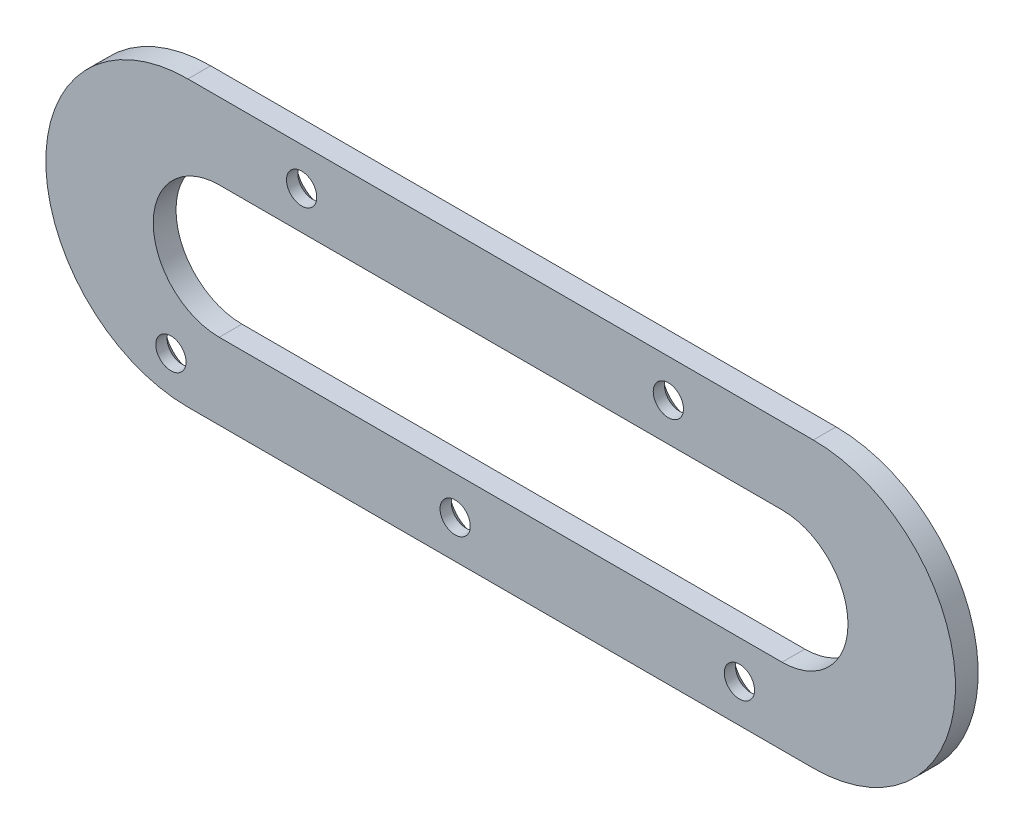
ISO-10303-21;
HEADER;
FILE_DESCRIPTION(('STEP AP214'),'2;1');
FILE_NAME('part.step','',(''),(''),'','','');
FILE_SCHEMA(('AUTOMOTIVE_DESIGN { 1 0 10303 214 1 1 1 1 }'));
ENDSEC;
DATA;
#1=APPLICATION_CONTEXT('core data for automotive mechanical design processes');
#2=APPLICATION_PROTOCOL_DEFINITION('international standard','automotive_design',2000,#1);
#3=PRODUCT_CONTEXT('',#1,'mechanical');
#4=PRODUCT('Part','Part','',(#3));
#5=PRODUCT_RELATED_PRODUCT_CATEGORY('part','',(#4));
#6=PRODUCT_DEFINITION_FORMATION('','',#4);
#7=PRODUCT_DEFINITION_CONTEXT('part definition',#1,'design');
#8=PRODUCT_DEFINITION('design','',#6,#7);
#9=PRODUCT_DEFINITION_SHAPE('','',#8);
#10=(LENGTH_UNIT() NAMED_UNIT(*) SI_UNIT(.MILLI.,.METRE.));
#11=(NAMED_UNIT(*) PLANE_ANGLE_UNIT() SI_UNIT($,.RADIAN.));
#12=(NAMED_UNIT(*) SI_UNIT($,.STERADIAN.) SOLID_ANGLE_UNIT());
#13=UNCERTAINTY_MEASURE_WITH_UNIT(LENGTH_MEASURE(1.E-05),#10,'distance_accuracy_value','');
#14=(GEOMETRIC_REPRESENTATION_CONTEXT(3) GLOBAL_UNCERTAINTY_ASSIGNED_CONTEXT((#13)) GLOBAL_UNIT_ASSIGNED_CONTEXT((#10,
#11,#12)) REPRESENTATION_CONTEXT('',''));
#15=CARTESIAN_POINT('',(0.,0.,0.));
#16=DIRECTION('',(0.,0.,1.));
#17=DIRECTION('',(1.,0.,0.));
#18=AXIS2_PLACEMENT_3D('',#15,#16,#17);
#19=CARTESIAN_POINT('',(-95.25,-16.8817402630384,5.08));
#20=DIRECTION('',(0.,0.,-1.));
#21=DIRECTION('',(-1.,0.,0.));
#22=AXIS2_PLACEMENT_3D('',#19,#20,#21);
#23=CYLINDRICAL_SURFACE('',#22,31.75);
#24=CARTESIAN_POINT('',(-95.25,-16.8817402630384,0.));
#25=DIRECTION('',(0.,0.,1.));
#26=DIRECTION('',(1.,0.,0.));
#27=AXIS2_PLACEMENT_3D('',#24,#25,#26);
#28=CIRCLE('',#27,31.75);
#29=CARTESIAN_POINT('',(-95.25,-48.6317402630384,0.));
#30=VERTEX_POINT('',#29);
#31=CARTESIAN_POINT('',(-95.25,14.8682597369616,0.));
#32=VERTEX_POINT('',#31);
#33=EDGE_CURVE('E136',#30,#32,#28,.T.);
#34=ORIENTED_EDGE('',*,*,#33,.T.);
#35=DIRECTION('',(0.,0.,-1.));
#36=VECTOR('',#35,1.);
#37=CARTESIAN_POINT('',(-95.25,14.8682597369616,5.08));
#38=LINE('',#37,#36);
#39=CARTESIAN_POINT('',(-95.25,14.8682597369616,5.08));
#40=VERTEX_POINT('',#39);
#41=EDGE_CURVE('E11',#40,#32,#38,.T.);
#42=ORIENTED_EDGE('',*,*,#41,.F.);
#43=CARTESIAN_POINT('',(-95.25,-16.8817402630384,5.08));
#44=DIRECTION('',(0.,0.,1.));
#45=DIRECTION('',(1.,0.,0.));
#46=AXIS2_PLACEMENT_3D('',#43,#44,#45);
#47=CIRCLE('',#46,31.75);
#48=CARTESIAN_POINT('',(-95.25,-48.6317402630384,5.08));
#49=VERTEX_POINT('',#48);
#50=EDGE_CURVE('E137',#49,#40,#47,.T.);
#51=ORIENTED_EDGE('',*,*,#50,.F.);
#52=DIRECTION('',(0.,0.,-1.));
#53=VECTOR('',#52,1.);
#54=CARTESIAN_POINT('',(-95.25,-48.6317402630384,5.08));
#55=LINE('',#54,#53);
#56=EDGE_CURVE('E147',#49,#30,#55,.T.);
#57=ORIENTED_EDGE('',*,*,#56,.T.);
#58=EDGE_LOOP('',(#34,#42,#51,#57));
#59=FACE_BOUND('',#58,.T.);
#60=ADVANCED_FACE('F37',(#59),#23,.T.);
#61=CARTESIAN_POINT('',(-95.25,14.8682597369616,5.08));
#62=DIRECTION('',(0.,-1.,0.));
#63=DIRECTION('',(1.,0.,0.));
#64=AXIS2_PLACEMENT_3D('',#61,#62,#63);
#65=PLANE('',#64);
#66=DIRECTION('',(-1.,0.,0.));
#67=VECTOR('',#66,1.);
#68=CARTESIAN_POINT('',(-95.25,14.8682597369616,0.));
#69=LINE('',#68,#67);
#70=CARTESIAN_POINT('',(-234.95,14.8682597369616,0.));
#71=VERTEX_POINT('',#70);
#72=EDGE_CURVE('E150',#32,#71,#69,.T.);
#73=ORIENTED_EDGE('',*,*,#72,.T.);
#74=DIRECTION('',(0.,0.,-1.));
#75=VECTOR('',#74,1.);
#76=CARTESIAN_POINT('',(-234.95,14.8682597369616,5.08));
#77=LINE('',#76,#75);
#78=CARTESIAN_POINT('',(-234.95,14.8682597369616,5.08));
#79=VERTEX_POINT('',#78);
#80=EDGE_CURVE('E44',#79,#71,#77,.T.);
#81=ORIENTED_EDGE('',*,*,#80,.F.);
#82=DIRECTION('',(-1.,0.,0.));
#83=VECTOR('',#82,1.);
#84=CARTESIAN_POINT('',(-95.25,14.8682597369616,5.08));
#85=LINE('',#84,#83);
#86=EDGE_CURVE('E140',#40,#79,#85,.T.);
#87=ORIENTED_EDGE('',*,*,#86,.F.);
#88=ORIENTED_EDGE('',*,*,#41,.T.);
#89=EDGE_LOOP('',(#73,#81,#87,#88));
#90=FACE_BOUND('',#89,.T.);
#91=ADVANCED_FACE('F178',(#90),#65,.F.);
#92=CARTESIAN_POINT('',(-234.95,-16.8817402630384,5.08));
#93=DIRECTION('',(0.,0.,-1.));
#94=DIRECTION('',(-1.,0.,0.));
#95=AXIS2_PLACEMENT_3D('',#92,#93,#94);
#96=CYLINDRICAL_SURFACE('',#95,31.75);
#97=CARTESIAN_POINT('',(-234.95,-16.8817402630384,0.));
#98=DIRECTION('',(0.,0.,1.));
#99=DIRECTION('',(1.,0.,0.));
#100=AXIS2_PLACEMENT_3D('',#97,#98,#99);
#101=CIRCLE('',#100,31.75);
#102=CARTESIAN_POINT('',(-234.95,-48.6317402630384,0.));
#103=VERTEX_POINT('',#102);
#104=EDGE_CURVE('E152',#71,#103,#101,.T.);
#105=ORIENTED_EDGE('',*,*,#104,.T.);
#106=DIRECTION('',(0.,0.,-1.));
#107=VECTOR('',#106,1.);
#108=CARTESIAN_POINT('',(-234.95,-48.6317402630384,5.08));
#109=LINE('',#108,#107);
#110=CARTESIAN_POINT('',(-234.95,-48.6317402630384,5.08));
#111=VERTEX_POINT('',#110);
#112=EDGE_CURVE('E157',#111,#103,#109,.T.);
#113=ORIENTED_EDGE('',*,*,#112,.F.);
#114=CARTESIAN_POINT('',(-234.95,-16.8817402630384,5.08));
#115=DIRECTION('',(0.,0.,1.));
#116=DIRECTION('',(1.,0.,0.));
#117=AXIS2_PLACEMENT_3D('',#114,#115,#116);
#118=CIRCLE('',#117,31.75);
#119=EDGE_CURVE('E143',#79,#111,#118,.T.);
#120=ORIENTED_EDGE('',*,*,#119,.F.);
#121=ORIENTED_EDGE('',*,*,#80,.T.);
#122=EDGE_LOOP('',(#105,#113,#120,#121));
#123=FACE_BOUND('',#122,.T.);
#124=ADVANCED_FACE('F164',(#123),#96,.T.);
#125=CARTESIAN_POINT('',(-95.25,-48.6317402630384,5.08));
#126=DIRECTION('',(0.,1.,0.));
#127=DIRECTION('',(-1.,0.,0.));
#128=AXIS2_PLACEMENT_3D('',#125,#126,#127);
#129=PLANE('',#128);
#130=DIRECTION('',(1.,0.,0.));
#131=VECTOR('',#130,1.);
#132=CARTESIAN_POINT('',(-95.25,-48.6317402630384,0.));
#133=LINE('',#132,#131);
#134=EDGE_CURVE('E141',#103,#30,#133,.T.);
#135=ORIENTED_EDGE('',*,*,#134,.T.);
#136=ORIENTED_EDGE('',*,*,#56,.F.);
#137=DIRECTION('',(1.,0.,0.));
#138=VECTOR('',#137,1.);
#139=CARTESIAN_POINT('',(-95.25,-48.6317402630384,5.08));
#140=LINE('',#139,#138);
#141=EDGE_CURVE('E145',#111,#49,#140,.T.);
#142=ORIENTED_EDGE('',*,*,#141,.F.);
#143=ORIENTED_EDGE('',*,*,#112,.T.);
#144=EDGE_LOOP('',(#135,#136,#142,#143));
#145=FACE_BOUND('',#144,.T.);
#146=ADVANCED_FACE('F171',(#145),#129,.F.);
#147=CARTESIAN_POINT('',(-95.25,-16.8817402630384,5.08));
#148=DIRECTION('',(0.,0.,1.));
#149=DIRECTION('',(1.,0.,0.));
#150=AXIS2_PLACEMENT_3D('',#147,#148,#149);
#151=PLANE('',#150);
#152=CARTESIAN_POINT('',(-238.76,-40.1227402630385,5.08000000000001));
#153=DIRECTION('',(0.,0.,-1.));
#154=DIRECTION('',(-1.,0.,0.));
#155=AXIS2_PLACEMENT_3D('',#152,#153,#154);
#156=CIRCLE('',#155,3.3782);
#157=CARTESIAN_POINT('',(-242.1382,-40.1227402630385,5.08000000000001));
#158=VERTEX_POINT('',#157);
#159=EDGE_CURVE('E254',#158,#158,#156,.T.);
#160=ORIENTED_EDGE('',*,*,#159,.T.);
#161=EDGE_LOOP('',(#160));
#162=FACE_BOUND('',#161,.T.);
#163=CARTESIAN_POINT('',(-111.76,-40.1227402630385,5.08000000000001));
#164=DIRECTION('',(0.,0.,-1.));
#165=DIRECTION('',(-1.,0.,0.));
#166=AXIS2_PLACEMENT_3D('',#163,#164,#165);
#167=CIRCLE('',#166,3.3782);
#168=CARTESIAN_POINT('',(-115.1382,-40.1227402630385,5.08000000000001));
#169=VERTEX_POINT('',#168);
#170=EDGE_CURVE('E265',#169,#169,#167,.T.);
#171=ORIENTED_EDGE('',*,*,#170,.T.);
#172=EDGE_LOOP('',(#171));
#173=FACE_BOUND('',#172,.T.);
#174=CARTESIAN_POINT('',(-175.26,-40.1227402630385,5.08000000000001));
#175=DIRECTION('',(0.,0.,-1.));
#176=DIRECTION('',(-1.,0.,0.));
#177=AXIS2_PLACEMENT_3D('',#174,#175,#176);
#178=CIRCLE('',#177,3.3782);
#179=CARTESIAN_POINT('',(-178.6382,-40.1227402630385,5.08000000000001));
#180=VERTEX_POINT('',#179);
#181=EDGE_CURVE('E274',#180,#180,#178,.T.);
#182=ORIENTED_EDGE('',*,*,#181,.T.);
#183=EDGE_LOOP('',(#182));
#184=FACE_BOUND('',#183,.T.);
#185=CARTESIAN_POINT('',(-127.635,6.35925973696162,5.08000000000001));
#186=DIRECTION('',(0.,0.,-1.));
#187=DIRECTION('',(-1.,0.,0.));
#188=AXIS2_PLACEMENT_3D('',#185,#186,#187);
#189=CIRCLE('',#188,3.3782);
#190=CARTESIAN_POINT('',(-131.0132,6.35925973696162,5.08000000000001));
#191=VERTEX_POINT('',#190);
#192=EDGE_CURVE('E283',#191,#191,#189,.T.);
#193=ORIENTED_EDGE('',*,*,#192,.T.);
#194=EDGE_LOOP('',(#193));
#195=FACE_BOUND('',#194,.T.);
#196=CARTESIAN_POINT('',(-209.55,6.35925973696162,5.08000000000001));
#197=DIRECTION('',(0.,0.,-1.));
#198=DIRECTION('',(-1.,0.,0.));
#199=AXIS2_PLACEMENT_3D('',#196,#197,#198);
#200=CIRCLE('',#199,3.3782);
#201=CARTESIAN_POINT('',(-212.9282,6.35925973696162,5.08000000000001));
#202=VERTEX_POINT('',#201);
#203=EDGE_CURVE('E292',#202,#202,#200,.T.);
#204=ORIENTED_EDGE('',*,*,#203,.T.);
#205=EDGE_LOOP('',(#204));
#206=FACE_BOUND('',#205,.T.);
#207=CARTESIAN_POINT('',(-227.965,-16.8817402630383,5.08));
#208=DIRECTION('',(0.,0.,1.));
#209=DIRECTION('',(1.,0.,0.));
#210=AXIS2_PLACEMENT_3D('',#207,#208,#209);
#211=CIRCLE('',#210,14.7320000000001);
#212=CARTESIAN_POINT('',(-227.965,-2.14974026303826,5.08000000000002));
#213=VERTEX_POINT('',#212);
#214=CARTESIAN_POINT('',(-227.965,-31.6137402630384,5.08000000000002));
#215=VERTEX_POINT('',#214);
#216=EDGE_CURVE('E134',#213,#215,#211,.T.);
#217=ORIENTED_EDGE('',*,*,#216,.F.);
#218=DIRECTION('',(-1.,0.,0.));
#219=VECTOR('',#218,1.);
#220=CARTESIAN_POINT('',(-95.25,-2.14974026303828,5.08));
#221=LINE('',#220,#219);
#222=CARTESIAN_POINT('',(-102.235,-2.14974026303828,5.08));
#223=VERTEX_POINT('',#222);
#224=EDGE_CURVE('E127',#223,#213,#221,.T.);
#225=ORIENTED_EDGE('',*,*,#224,.F.);
#226=CARTESIAN_POINT('',(-102.235,-16.8817402630384,5.08));
#227=DIRECTION('',(0.,0.,1.));
#228=DIRECTION('',(1.,0.,0.));
#229=AXIS2_PLACEMENT_3D('',#226,#227,#228);
#230=CIRCLE('',#229,14.7320000000001);
#231=CARTESIAN_POINT('',(-102.235,-31.6137402630385,5.08000000000002));
#232=VERTEX_POINT('',#231);
#233=EDGE_CURVE('E107',#232,#223,#230,.T.);
#234=ORIENTED_EDGE('',*,*,#233,.F.);
#235=DIRECTION('',(1.,0.,0.));
#236=VECTOR('',#235,1.);
#237=CARTESIAN_POINT('',(-95.25,-31.6137402630385,5.08));
#238=LINE('',#237,#236);
#239=EDGE_CURVE('E132',#215,#232,#238,.T.);
#240=ORIENTED_EDGE('',*,*,#239,.F.);
#241=EDGE_LOOP('',(#217,#225,#234,#240));
#242=FACE_BOUND('',#241,.T.);
#243=ORIENTED_EDGE('',*,*,#50,.T.);
#244=ORIENTED_EDGE('',*,*,#86,.T.);
#245=ORIENTED_EDGE('',*,*,#119,.T.);
#246=ORIENTED_EDGE('',*,*,#141,.T.);
#247=EDGE_LOOP('',(#243,#244,#245,#246));
#248=FACE_BOUND('',#247,.T.);
#249=ADVANCED_FACE('F177',(#162,#173,#184,#195,#206,#242,#248),#151,.T.);
#250=CARTESIAN_POINT('',(-95.25,-16.8817402630384,0.));
#251=DIRECTION('',(0.,0.,1.));
#252=DIRECTION('',(1.,0.,0.));
#253=AXIS2_PLACEMENT_3D('',#250,#251,#252);
#254=PLANE('',#253);
#255=CARTESIAN_POINT('',(-238.76,-40.1227402630385,0.));
#256=DIRECTION('',(0.,0.,-1.));
#257=DIRECTION('',(-1.,0.,0.));
#258=AXIS2_PLACEMENT_3D('',#255,#256,#257);
#259=CIRCLE('',#258,6.4389);
#260=CARTESIAN_POINT('',(-245.1989,-40.1227402630385,0.));
#261=VERTEX_POINT('',#260);
#262=EDGE_CURVE('E252',#261,#261,#259,.T.);
#263=ORIENTED_EDGE('',*,*,#262,.F.);
#264=EDGE_LOOP('',(#263));
#265=FACE_BOUND('',#264,.T.);
#266=CARTESIAN_POINT('',(-111.76,-40.1227402630385,0.));
#267=DIRECTION('',(0.,0.,-1.));
#268=DIRECTION('',(-1.,0.,0.));
#269=AXIS2_PLACEMENT_3D('',#266,#267,#268);
#270=CIRCLE('',#269,6.4389);
#271=CARTESIAN_POINT('',(-118.1989,-40.1227402630385,0.));
#272=VERTEX_POINT('',#271);
#273=EDGE_CURVE('E259',#272,#272,#270,.T.);
#274=ORIENTED_EDGE('',*,*,#273,.F.);
#275=EDGE_LOOP('',(#274));
#276=FACE_BOUND('',#275,.T.);
#277=CARTESIAN_POINT('',(-175.26,-40.1227402630385,0.));
#278=DIRECTION('',(0.,0.,-1.));
#279=DIRECTION('',(-1.,0.,0.));
#280=AXIS2_PLACEMENT_3D('',#277,#278,#279);
#281=CIRCLE('',#280,6.4389);
#282=CARTESIAN_POINT('',(-181.6989,-40.1227402630385,0.));
#283=VERTEX_POINT('',#282);
#284=EDGE_CURVE('E268',#283,#283,#281,.T.);
#285=ORIENTED_EDGE('',*,*,#284,.F.);
#286=EDGE_LOOP('',(#285));
#287=FACE_BOUND('',#286,.T.);
#288=CARTESIAN_POINT('',(-127.635,6.35925973696162,0.));
#289=DIRECTION('',(0.,0.,-1.));
#290=DIRECTION('',(-1.,0.,0.));
#291=AXIS2_PLACEMENT_3D('',#288,#289,#290);
#292=CIRCLE('',#291,6.4389);
#293=CARTESIAN_POINT('',(-134.0739,6.35925973696162,0.));
#294=VERTEX_POINT('',#293);
#295=EDGE_CURVE('E277',#294,#294,#292,.T.);
#296=ORIENTED_EDGE('',*,*,#295,.F.);
#297=EDGE_LOOP('',(#296));
#298=FACE_BOUND('',#297,.T.);
#299=CARTESIAN_POINT('',(-209.55,6.35925973696162,0.));
#300=DIRECTION('',(0.,0.,-1.));
#301=DIRECTION('',(-1.,0.,0.));
#302=AXIS2_PLACEMENT_3D('',#299,#300,#301);
#303=CIRCLE('',#302,6.4389);
#304=CARTESIAN_POINT('',(-215.9889,6.35925973696162,0.));
#305=VERTEX_POINT('',#304);
#306=EDGE_CURVE('E286',#305,#305,#303,.T.);
#307=ORIENTED_EDGE('',*,*,#306,.F.);
#308=EDGE_LOOP('',(#307));
#309=FACE_BOUND('',#308,.T.);
#310=DIRECTION('',(1.,0.,0.));
#311=VECTOR('',#310,1.);
#312=CARTESIAN_POINT('',(-227.965,-2.14974026303826,0.));
#313=LINE('',#312,#311);
#314=CARTESIAN_POINT('',(-227.965,-2.14974026303826,0.));
#315=VERTEX_POINT('',#314);
#316=CARTESIAN_POINT('',(-102.235,-2.14974026303826,0.));
#317=VERTEX_POINT('',#316);
#318=EDGE_CURVE('E113',#315,#317,#313,.T.);
#319=ORIENTED_EDGE('',*,*,#318,.F.);
#320=CARTESIAN_POINT('',(-227.965,-16.8817402630383,0.));
#321=DIRECTION('',(0.,0.,-1.));
#322=DIRECTION('',(-1.,0.,0.));
#323=AXIS2_PLACEMENT_3D('',#320,#321,#322);
#324=CIRCLE('',#323,14.7320000000001);
#325=CARTESIAN_POINT('',(-227.965,-31.6137402630384,0.));
#326=VERTEX_POINT('',#325);
#327=EDGE_CURVE('E59',#326,#315,#324,.T.);
#328=ORIENTED_EDGE('',*,*,#327,.F.);
#329=DIRECTION('',(-1.,0.,0.));
#330=VECTOR('',#329,1.);
#331=CARTESIAN_POINT('',(-227.965,-31.6137402630384,0.));
#332=LINE('',#331,#330);
#333=CARTESIAN_POINT('',(-102.235,-31.6137402630385,0.));
#334=VERTEX_POINT('',#333);
#335=EDGE_CURVE('E120',#334,#326,#332,.T.);
#336=ORIENTED_EDGE('',*,*,#335,.F.);
#337=CARTESIAN_POINT('',(-102.235,-16.8817402630384,0.));
#338=DIRECTION('',(0.,0.,-1.));
#339=DIRECTION('',(-1.,0.,0.));
#340=AXIS2_PLACEMENT_3D('',#337,#338,#339);
#341=CIRCLE('',#340,14.7320000000001);
#342=EDGE_CURVE('E104',#317,#334,#341,.T.);
#343=ORIENTED_EDGE('',*,*,#342,.F.);
#344=EDGE_LOOP('',(#319,#328,#336,#343));
#345=FACE_BOUND('',#344,.T.);
#346=ORIENTED_EDGE('',*,*,#33,.F.);
#347=ORIENTED_EDGE('',*,*,#134,.F.);
#348=ORIENTED_EDGE('',*,*,#104,.F.);
#349=ORIENTED_EDGE('',*,*,#72,.F.);
#350=EDGE_LOOP('',(#346,#347,#348,#349));
#351=FACE_BOUND('',#350,.T.);
#352=ADVANCED_FACE('F117',(#265,#276,#287,#298,#309,#345,#351),#254,.F.);
#353=CARTESIAN_POINT('',(-227.965,-16.8817402630383,38.862));
#354=DIRECTION('',(0.,0.,-1.));
#355=DIRECTION('',(-1.,0.,0.));
#356=AXIS2_PLACEMENT_3D('',#353,#354,#355);
#357=CYLINDRICAL_SURFACE('',#356,14.7320000000001);
#358=ORIENTED_EDGE('',*,*,#216,.T.);
#359=DIRECTION('',(0.,0.,-1.));
#360=VECTOR('',#359,1.);
#361=CARTESIAN_POINT('',(-227.965,-31.6137402630384,38.862));
#362=LINE('',#361,#360);
#363=EDGE_CURVE('E125',#215,#326,#362,.T.);
#364=ORIENTED_EDGE('',*,*,#363,.T.);
#365=ORIENTED_EDGE('',*,*,#327,.T.);
#366=DIRECTION('',(0.,0.,-1.));
#367=VECTOR('',#366,1.);
#368=CARTESIAN_POINT('',(-227.965,-2.14974026303826,38.862));
#369=LINE('',#368,#367);
#370=EDGE_CURVE('E110',#213,#315,#369,.T.);
#371=ORIENTED_EDGE('',*,*,#370,.F.);
#372=EDGE_LOOP('',(#358,#364,#365,#371));
#373=FACE_BOUND('',#372,.T.);
#374=ADVANCED_FACE('F190',(#373),#357,.F.);
#375=CARTESIAN_POINT('',(-227.965,-31.6137402630384,38.862));
#376=DIRECTION('',(0.,-1.,0.));
#377=DIRECTION('',(1.,0.,0.));
#378=AXIS2_PLACEMENT_3D('',#375,#376,#377);
#379=PLANE('',#378);
#380=ORIENTED_EDGE('',*,*,#239,.T.);
#381=DIRECTION('',(0.,0.,-1.));
#382=VECTOR('',#381,1.);
#383=CARTESIAN_POINT('',(-102.235,-31.6137402630385,38.862));
#384=LINE('',#383,#382);
#385=EDGE_CURVE('E109',#232,#334,#384,.T.);
#386=ORIENTED_EDGE('',*,*,#385,.T.);
#387=ORIENTED_EDGE('',*,*,#335,.T.);
#388=ORIENTED_EDGE('',*,*,#363,.F.);
#389=EDGE_LOOP('',(#380,#386,#387,#388));
#390=FACE_BOUND('',#389,.T.);
#391=ADVANCED_FACE('F197',(#390),#379,.F.);
#392=CARTESIAN_POINT('',(-102.235,-16.8817402630384,38.862));
#393=DIRECTION('',(0.,0.,-1.));
#394=DIRECTION('',(-1.,0.,0.));
#395=AXIS2_PLACEMENT_3D('',#392,#393,#394);
#396=CYLINDRICAL_SURFACE('',#395,14.7320000000001);
#397=ORIENTED_EDGE('',*,*,#233,.T.);
#398=DIRECTION('',(0.,0.,-1.));
#399=VECTOR('',#398,1.);
#400=CARTESIAN_POINT('',(-102.235,-2.14974026303826,38.862));
#401=LINE('',#400,#399);
#402=EDGE_CURVE('E51',#223,#317,#401,.T.);
#403=ORIENTED_EDGE('',*,*,#402,.T.);
#404=ORIENTED_EDGE('',*,*,#342,.T.);
#405=ORIENTED_EDGE('',*,*,#385,.F.);
#406=EDGE_LOOP('',(#397,#403,#404,#405));
#407=FACE_BOUND('',#406,.T.);
#408=ADVANCED_FACE('F101',(#407),#396,.F.);
#409=CARTESIAN_POINT('',(-227.965,-2.14974026303826,38.862));
#410=DIRECTION('',(0.,1.,0.));
#411=DIRECTION('',(-1.,0.,0.));
#412=AXIS2_PLACEMENT_3D('',#409,#410,#411);
#413=PLANE('',#412);
#414=ORIENTED_EDGE('',*,*,#224,.T.);
#415=ORIENTED_EDGE('',*,*,#370,.T.);
#416=ORIENTED_EDGE('',*,*,#318,.T.);
#417=ORIENTED_EDGE('',*,*,#402,.F.);
#418=EDGE_LOOP('',(#414,#415,#416,#417));
#419=FACE_BOUND('',#418,.T.);
#420=ADVANCED_FACE('F114',(#419),#413,.F.);
#421=CARTESIAN_POINT('',(-209.55,6.35925973696162,0.));
#422=DIRECTION('',(0.,0.,-1.));
#423=DIRECTION('',(-1.,0.,0.));
#424=AXIS2_PLACEMENT_3D('',#421,#422,#423);
#425=CYLINDRICAL_SURFACE('',#424,3.3782);
#426=ORIENTED_EDGE('',*,*,#203,.F.);
#427=EDGE_LOOP('',(#426));
#428=FACE_BOUND('',#427,.T.);
#429=CARTESIAN_POINT('',(-209.55,6.35925973696162,2.56823224114432));
#430=DIRECTION('',(0.,0.,-1.));
#431=DIRECTION('',(-1.,0.,0.));
#432=AXIS2_PLACEMENT_3D('',#429,#430,#431);
#433=CIRCLE('',#432,3.3782);
#434=CARTESIAN_POINT('',(-212.9282,6.35925973696162,2.56823224114432));
#435=VERTEX_POINT('',#434);
#436=EDGE_CURVE('E289',#435,#435,#433,.T.);
#437=ORIENTED_EDGE('',*,*,#436,.T.);
#438=EDGE_LOOP('',(#437));
#439=FACE_BOUND('',#438,.T.);
#440=ADVANCED_FACE('F200',(#428,#439),#425,.F.);
#441=CARTESIAN_POINT('',(-209.55,6.35925973696162,0.));
#442=DIRECTION('',(0.,0.,-1.));
#443=DIRECTION('',(-1.,0.,0.));
#444=AXIS2_PLACEMENT_3D('',#441,#442,#443);
#445=CONICAL_SURFACE('',#444,6.4389,0.872664625997162);
#446=ORIENTED_EDGE('',*,*,#436,.F.);
#447=EDGE_LOOP('',(#446));
#448=FACE_BOUND('',#447,.T.);
#449=ORIENTED_EDGE('',*,*,#306,.T.);
#450=EDGE_LOOP('',(#449));
#451=FACE_BOUND('',#450,.T.);
#452=ADVANCED_FACE('F208',(#448,#451),#445,.F.);
#453=CARTESIAN_POINT('',(-127.635,6.35925973696162,0.));
#454=DIRECTION('',(0.,0.,-1.));
#455=DIRECTION('',(-1.,0.,0.));
#456=AXIS2_PLACEMENT_3D('',#453,#454,#455);
#457=CYLINDRICAL_SURFACE('',#456,3.37819999999999);
#458=ORIENTED_EDGE('',*,*,#192,.F.);
#459=EDGE_LOOP('',(#458));
#460=FACE_BOUND('',#459,.T.);
#461=CARTESIAN_POINT('',(-127.635,6.35925973696162,2.56823224114432));
#462=DIRECTION('',(0.,0.,-1.));
#463=DIRECTION('',(-1.,0.,0.));
#464=AXIS2_PLACEMENT_3D('',#461,#462,#463);
#465=CIRCLE('',#464,3.37819999999998);
#466=CARTESIAN_POINT('',(-131.0132,6.35925973696162,2.56823224114432));
#467=VERTEX_POINT('',#466);
#468=EDGE_CURVE('E280',#467,#467,#465,.T.);
#469=ORIENTED_EDGE('',*,*,#468,.T.);
#470=EDGE_LOOP('',(#469));
#471=FACE_BOUND('',#470,.T.);
#472=ADVANCED_FACE('F212',(#460,#471),#457,.F.);
#473=CARTESIAN_POINT('',(-127.635,6.35925973696162,0.));
#474=DIRECTION('',(0.,0.,-1.));
#475=DIRECTION('',(-1.,0.,0.));
#476=AXIS2_PLACEMENT_3D('',#473,#474,#475);
#477=CONICAL_SURFACE('',#476,6.4389,0.872664625997164);
#478=ORIENTED_EDGE('',*,*,#468,.F.);
#479=EDGE_LOOP('',(#478));
#480=FACE_BOUND('',#479,.T.);
#481=ORIENTED_EDGE('',*,*,#295,.T.);
#482=EDGE_LOOP('',(#481));
#483=FACE_BOUND('',#482,.T.);
#484=ADVANCED_FACE('F216',(#480,#483),#477,.F.);
#485=CARTESIAN_POINT('',(-175.26,-40.1227402630385,0.));
#486=DIRECTION('',(0.,0.,-1.));
#487=DIRECTION('',(-1.,0.,0.));
#488=AXIS2_PLACEMENT_3D('',#485,#486,#487);
#489=CYLINDRICAL_SURFACE('',#488,3.3782);
#490=ORIENTED_EDGE('',*,*,#181,.F.);
#491=EDGE_LOOP('',(#490));
#492=FACE_BOUND('',#491,.T.);
#493=CARTESIAN_POINT('',(-175.26,-40.1227402630385,2.56823224114432));
#494=DIRECTION('',(0.,0.,-1.));
#495=DIRECTION('',(-1.,0.,0.));
#496=AXIS2_PLACEMENT_3D('',#493,#494,#495);
#497=CIRCLE('',#496,3.3782);
#498=CARTESIAN_POINT('',(-178.6382,-40.1227402630385,2.56823224114432));
#499=VERTEX_POINT('',#498);
#500=EDGE_CURVE('E271',#499,#499,#497,.T.);
#501=ORIENTED_EDGE('',*,*,#500,.T.);
#502=EDGE_LOOP('',(#501));
#503=FACE_BOUND('',#502,.T.);
#504=ADVANCED_FACE('F220',(#492,#503),#489,.F.);
#505=CARTESIAN_POINT('',(-175.26,-40.1227402630385,0.));
#506=DIRECTION('',(0.,0.,-1.));
#507=DIRECTION('',(-1.,0.,0.));
#508=AXIS2_PLACEMENT_3D('',#505,#506,#507);
#509=CONICAL_SURFACE('',#508,6.4389,0.872664625997162);
#510=ORIENTED_EDGE('',*,*,#500,.F.);
#511=EDGE_LOOP('',(#510));
#512=FACE_BOUND('',#511,.T.);
#513=ORIENTED_EDGE('',*,*,#284,.T.);
#514=EDGE_LOOP('',(#513));
#515=FACE_BOUND('',#514,.T.);
#516=ADVANCED_FACE('F224',(#512,#515),#509,.F.);
#517=CARTESIAN_POINT('',(-111.76,-40.1227402630385,0.));
#518=DIRECTION('',(0.,0.,-1.));
#519=DIRECTION('',(-1.,0.,0.));
#520=AXIS2_PLACEMENT_3D('',#517,#518,#519);
#521=CYLINDRICAL_SURFACE('',#520,3.37819999999999);
#522=ORIENTED_EDGE('',*,*,#170,.F.);
#523=EDGE_LOOP('',(#522));
#524=FACE_BOUND('',#523,.T.);
#525=CARTESIAN_POINT('',(-111.76,-40.1227402630385,2.56823224114432));
#526=DIRECTION('',(0.,0.,-1.));
#527=DIRECTION('',(-1.,0.,0.));
#528=AXIS2_PLACEMENT_3D('',#525,#526,#527);
#529=CIRCLE('',#528,3.37819999999998);
#530=CARTESIAN_POINT('',(-115.1382,-40.1227402630385,2.56823224114432));
#531=VERTEX_POINT('',#530);
#532=EDGE_CURVE('E262',#531,#531,#529,.T.);
#533=ORIENTED_EDGE('',*,*,#532,.T.);
#534=EDGE_LOOP('',(#533));
#535=FACE_BOUND('',#534,.T.);
#536=ADVANCED_FACE('F228',(#524,#535),#521,.F.);
#537=CARTESIAN_POINT('',(-111.76,-40.1227402630385,0.));
#538=DIRECTION('',(0.,0.,-1.));
#539=DIRECTION('',(-1.,0.,0.));
#540=AXIS2_PLACEMENT_3D('',#537,#538,#539);
#541=CONICAL_SURFACE('',#540,6.4389,0.872664625997164);
#542=ORIENTED_EDGE('',*,*,#532,.F.);
#543=EDGE_LOOP('',(#542));
#544=FACE_BOUND('',#543,.T.);
#545=ORIENTED_EDGE('',*,*,#273,.T.);
#546=EDGE_LOOP('',(#545));
#547=FACE_BOUND('',#546,.T.);
#548=ADVANCED_FACE('F232',(#544,#547),#541,.F.);
#549=CARTESIAN_POINT('',(-238.76,-40.1227402630385,0.));
#550=DIRECTION('',(0.,0.,-1.));
#551=DIRECTION('',(-1.,0.,0.));
#552=AXIS2_PLACEMENT_3D('',#549,#550,#551);
#553=CYLINDRICAL_SURFACE('',#552,3.3782);
#554=ORIENTED_EDGE('',*,*,#159,.F.);
#555=EDGE_LOOP('',(#554));
#556=FACE_BOUND('',#555,.T.);
#557=CARTESIAN_POINT('',(-238.76,-40.1227402630385,2.56823224114432));
#558=DIRECTION('',(0.,0.,-1.));
#559=DIRECTION('',(-1.,0.,0.));
#560=AXIS2_PLACEMENT_3D('',#557,#558,#559);
#561=CIRCLE('',#560,3.3782);
#562=CARTESIAN_POINT('',(-242.1382,-40.1227402630385,2.56823224114432));
#563=VERTEX_POINT('',#562);
#564=EDGE_CURVE('E249',#563,#563,#561,.T.);
#565=ORIENTED_EDGE('',*,*,#564,.T.);
#566=EDGE_LOOP('',(#565));
#567=FACE_BOUND('',#566,.T.);
#568=ADVANCED_FACE('F236',(#556,#567),#553,.F.);
#569=CARTESIAN_POINT('',(-238.76,-40.1227402630385,0.));
#570=DIRECTION('',(0.,0.,-1.));
#571=DIRECTION('',(-1.,0.,0.));
#572=AXIS2_PLACEMENT_3D('',#569,#570,#571);
#573=CONICAL_SURFACE('',#572,6.4389,0.872664625997162);
#574=ORIENTED_EDGE('',*,*,#564,.F.);
#575=EDGE_LOOP('',(#574));
#576=FACE_BOUND('',#575,.T.);
#577=ORIENTED_EDGE('',*,*,#262,.T.);
#578=EDGE_LOOP('',(#577));
#579=FACE_BOUND('',#578,.T.);
#580=ADVANCED_FACE('F240',(#576,#579),#573,.F.);
#581=CLOSED_SHELL('',(#60,#91,#124,#146,#249,#352,#374,#391,#408,#420,#440,#452,#472,#484,#504,
#516,#536,#548,#568,#580));
#582=MANIFOLD_SOLID_BREP('B2',#581);
#583=ADVANCED_BREP_SHAPE_REPRESENTATION('',(#18,#582),#14);
#584=SHAPE_DEFINITION_REPRESENTATION(#9,#583);
ENDSEC;
END-ISO-10303-21;
